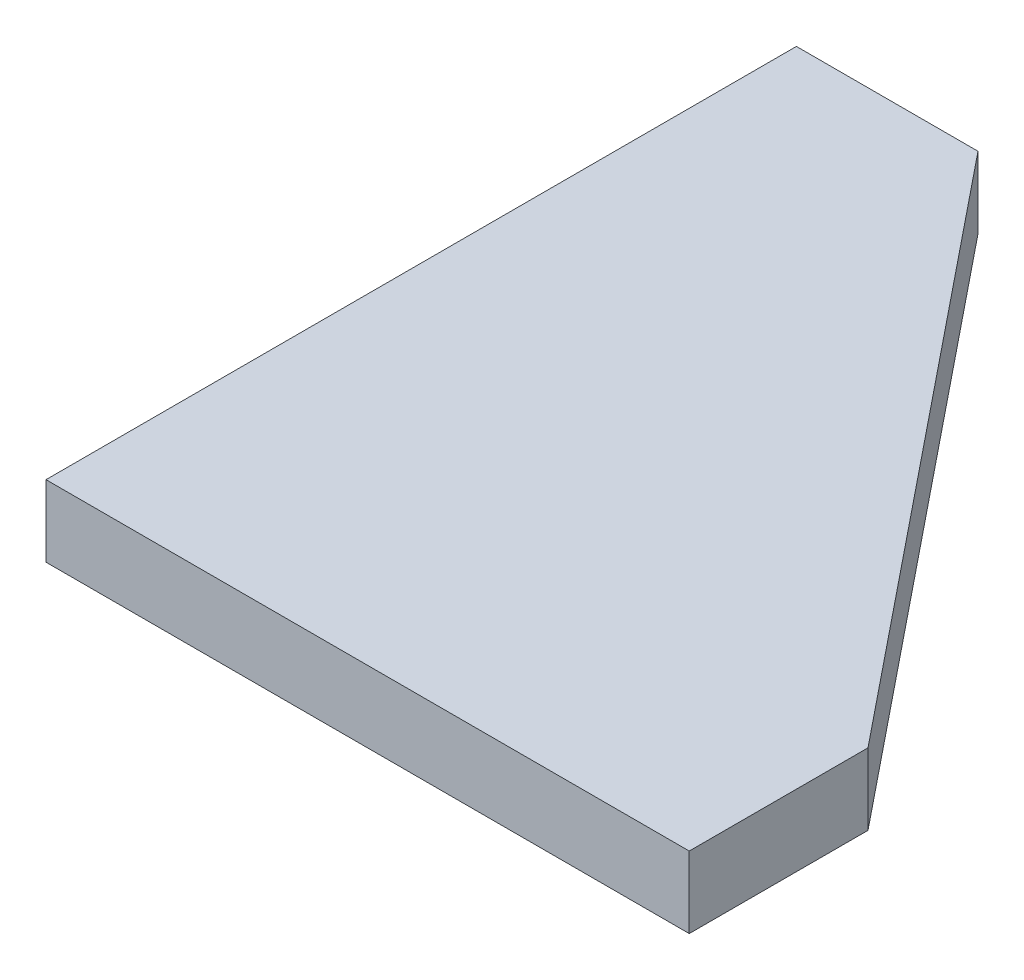
ISO-10303-21;
HEADER;
FILE_DESCRIPTION(('STEP AP214'),'2;1');
FILE_NAME('part.step','',(''),(''),'','','');
FILE_SCHEMA(('AUTOMOTIVE_DESIGN { 1 0 10303 214 1 1 1 1 }'));
ENDSEC;
DATA;
#1=APPLICATION_CONTEXT('core data for automotive mechanical design processes');
#2=APPLICATION_PROTOCOL_DEFINITION('international standard','automotive_design',2000,#1);
#3=PRODUCT_CONTEXT('',#1,'mechanical');
#4=PRODUCT('Part','Part','',(#3));
#5=PRODUCT_RELATED_PRODUCT_CATEGORY('part','',(#4));
#6=PRODUCT_DEFINITION_FORMATION('','',#4);
#7=PRODUCT_DEFINITION_CONTEXT('part definition',#1,'design');
#8=PRODUCT_DEFINITION('design','',#6,#7);
#9=PRODUCT_DEFINITION_SHAPE('','',#8);
#10=(LENGTH_UNIT() NAMED_UNIT(*) SI_UNIT(.MILLI.,.METRE.));
#11=(NAMED_UNIT(*) PLANE_ANGLE_UNIT() SI_UNIT($,.RADIAN.));
#12=(NAMED_UNIT(*) SI_UNIT($,.STERADIAN.) SOLID_ANGLE_UNIT());
#13=UNCERTAINTY_MEASURE_WITH_UNIT(LENGTH_MEASURE(1.E-05),#10,'distance_accuracy_value','');
#14=(GEOMETRIC_REPRESENTATION_CONTEXT(3) GLOBAL_UNCERTAINTY_ASSIGNED_CONTEXT((#13)) GLOBAL_UNIT_ASSIGNED_CONTEXT((#10,
#11,#12)) REPRESENTATION_CONTEXT('',''));
#15=CARTESIAN_POINT('',(0.,0.,0.));
#16=DIRECTION('',(0.,0.,1.));
#17=DIRECTION('',(1.,0.,0.));
#18=AXIS2_PLACEMENT_3D('',#15,#16,#17);
#19=CARTESIAN_POINT('',(0.,4.,0.));
#20=DIRECTION('',(1.,0.,0.));
#21=DIRECTION('',(0.,0.,-1.));
#22=AXIS2_PLACEMENT_3D('',#19,#20,#21);
#23=PLANE('',#22);
#24=DIRECTION('',(0.,0.,1.));
#25=VECTOR('',#24,1.);
#26=CARTESIAN_POINT('',(0.,0.,0.));
#27=LINE('',#26,#25);
#28=CARTESIAN_POINT('',(0.,0.,-41.9799593719108));
#29=VERTEX_POINT('',#28);
#30=CARTESIAN_POINT('',(0.,0.,0.));
#31=VERTEX_POINT('',#30);
#32=EDGE_CURVE('E105',#29,#31,#27,.T.);
#33=ORIENTED_EDGE('',*,*,#32,.T.);
#34=DIRECTION('',(0.,-1.,0.));
#35=VECTOR('',#34,1.);
#36=CARTESIAN_POINT('',(0.,4.,0.));
#37=LINE('',#36,#35);
#38=CARTESIAN_POINT('',(0.,4.,0.));
#39=VERTEX_POINT('',#38);
#40=EDGE_CURVE('E11',#39,#31,#37,.T.);
#41=ORIENTED_EDGE('',*,*,#40,.F.);
#42=DIRECTION('',(0.,0.,1.));
#43=VECTOR('',#42,1.);
#44=CARTESIAN_POINT('',(0.,4.,0.));
#45=LINE('',#44,#43);
#46=CARTESIAN_POINT('',(0.,4.,-41.9799593719108));
#47=VERTEX_POINT('',#46);
#48=EDGE_CURVE('E113',#47,#39,#45,.T.);
#49=ORIENTED_EDGE('',*,*,#48,.F.);
#50=DIRECTION('',(0.,-1.,0.));
#51=VECTOR('',#50,1.);
#52=CARTESIAN_POINT('',(0.,4.,-41.9799593719108));
#53=LINE('',#52,#51);
#54=EDGE_CURVE('E101',#47,#29,#53,.T.);
#55=ORIENTED_EDGE('',*,*,#54,.T.);
#56=EDGE_LOOP('',(#33,#41,#49,#55));
#57=FACE_BOUND('',#56,.T.);
#58=ADVANCED_FACE('F31',(#57),#23,.F.);
#59=CARTESIAN_POINT('',(0.,4.,0.));
#60=DIRECTION('',(0.,0.,-1.));
#61=DIRECTION('',(-1.,0.,0.));
#62=AXIS2_PLACEMENT_3D('',#59,#60,#61);
#63=PLANE('',#62);
#64=DIRECTION('',(1.,0.,0.));
#65=VECTOR('',#64,1.);
#66=CARTESIAN_POINT('',(0.,0.,0.));
#67=LINE('',#66,#65);
#68=CARTESIAN_POINT('',(35.9838685392107,0.,0.));
#69=VERTEX_POINT('',#68);
#70=EDGE_CURVE('E108',#31,#69,#67,.T.);
#71=ORIENTED_EDGE('',*,*,#70,.T.);
#72=DIRECTION('',(0.,-1.,0.));
#73=VECTOR('',#72,1.);
#74=CARTESIAN_POINT('',(35.9838685392107,4.,0.));
#75=LINE('',#74,#73);
#76=CARTESIAN_POINT('',(35.9838685392107,4.,0.));
#77=VERTEX_POINT('',#76);
#78=EDGE_CURVE('E39',#77,#69,#75,.T.);
#79=ORIENTED_EDGE('',*,*,#78,.F.);
#80=DIRECTION('',(1.,0.,0.));
#81=VECTOR('',#80,1.);
#82=CARTESIAN_POINT('',(0.,4.,0.));
#83=LINE('',#82,#81);
#84=EDGE_CURVE('E81',#39,#77,#83,.T.);
#85=ORIENTED_EDGE('',*,*,#84,.F.);
#86=ORIENTED_EDGE('',*,*,#40,.T.);
#87=EDGE_LOOP('',(#71,#79,#85,#86));
#88=FACE_BOUND('',#87,.T.);
#89=ADVANCED_FACE('F132',(#88),#63,.F.);
#90=CARTESIAN_POINT('',(35.9838685392107,4.,-10.0000001189553));
#91=DIRECTION('',(-1.,0.,0.));
#92=DIRECTION('',(0.,0.,1.));
#93=AXIS2_PLACEMENT_3D('',#90,#91,#92);
#94=PLANE('',#93);
#95=DIRECTION('',(0.,0.,-1.));
#96=VECTOR('',#95,1.);
#97=CARTESIAN_POINT('',(35.9838685392107,0.,-10.0000001189553));
#98=LINE('',#97,#96);
#99=CARTESIAN_POINT('',(35.9838685392107,0.,-10.0000001189553));
#100=VERTEX_POINT('',#99);
#101=EDGE_CURVE('E96',#69,#100,#98,.T.);
#102=ORIENTED_EDGE('',*,*,#101,.T.);
#103=DIRECTION('',(0.,-1.,0.));
#104=VECTOR('',#103,1.);
#105=CARTESIAN_POINT('',(35.9838685392107,4.,-10.0000001189553));
#106=LINE('',#105,#104);
#107=CARTESIAN_POINT('',(35.9838685392107,4.,-10.0000001189553));
#108=VERTEX_POINT('',#107);
#109=EDGE_CURVE('E93',#108,#100,#106,.T.);
#110=ORIENTED_EDGE('',*,*,#109,.F.);
#111=DIRECTION('',(0.,0.,-1.));
#112=VECTOR('',#111,1.);
#113=CARTESIAN_POINT('',(35.9838685392107,4.,-10.0000001189553));
#114=LINE('',#113,#112);
#115=EDGE_CURVE('E85',#77,#108,#114,.T.);
#116=ORIENTED_EDGE('',*,*,#115,.F.);
#117=ORIENTED_EDGE('',*,*,#78,.T.);
#118=EDGE_LOOP('',(#102,#110,#116,#117));
#119=FACE_BOUND('',#118,.T.);
#120=ADVANCED_FACE('F94',(#119),#94,.F.);
#121=CARTESIAN_POINT('',(10.1583775056886,4.,-41.9799593719108));
#122=DIRECTION('',(-0.777994404596502,0.,0.628271204510071));
#123=DIRECTION('',(0.628271204510071,0.,0.777994404596502));
#124=AXIS2_PLACEMENT_3D('',#121,#122,#123);
#125=PLANE('',#124);
#126=DIRECTION('',(-0.628271204510071,0.,-0.777994404596501));
#127=VECTOR('',#126,1.);
#128=CARTESIAN_POINT('',(10.1583775056886,0.,-41.9799593719108));
#129=LINE('',#128,#127);
#130=CARTESIAN_POINT('',(10.1583775056886,0.,-41.9799593719108));
#131=VERTEX_POINT('',#130);
#132=EDGE_CURVE('E67',#100,#131,#129,.T.);
#133=ORIENTED_EDGE('',*,*,#132,.T.);
#134=DIRECTION('',(0.,-1.,0.));
#135=VECTOR('',#134,1.);
#136=CARTESIAN_POINT('',(10.1583775056886,4.,-41.9799593719108));
#137=LINE('',#136,#135);
#138=CARTESIAN_POINT('',(10.1583775056886,4.,-41.9799593719108));
#139=VERTEX_POINT('',#138);
#140=EDGE_CURVE('E97',#139,#131,#137,.T.);
#141=ORIENTED_EDGE('',*,*,#140,.F.);
#142=DIRECTION('',(-0.628271204510071,0.,-0.777994404596501));
#143=VECTOR('',#142,1.);
#144=CARTESIAN_POINT('',(10.1583775056886,4.,-41.9799593719108));
#145=LINE('',#144,#143);
#146=EDGE_CURVE('E89',#108,#139,#145,.T.);
#147=ORIENTED_EDGE('',*,*,#146,.F.);
#148=ORIENTED_EDGE('',*,*,#109,.T.);
#149=EDGE_LOOP('',(#133,#141,#147,#148));
#150=FACE_BOUND('',#149,.T.);
#151=ADVANCED_FACE('F99',(#150),#125,.F.);
#152=CARTESIAN_POINT('',(0.,4.,-41.9799593719108));
#153=DIRECTION('',(0.,0.,1.));
#154=DIRECTION('',(1.,0.,0.));
#155=AXIS2_PLACEMENT_3D('',#152,#153,#154);
#156=PLANE('',#155);
#157=DIRECTION('',(-1.,0.,0.));
#158=VECTOR('',#157,1.);
#159=CARTESIAN_POINT('',(0.,0.,-41.9799593719108));
#160=LINE('',#159,#158);
#161=EDGE_CURVE('E73',#131,#29,#160,.T.);
#162=ORIENTED_EDGE('',*,*,#161,.T.);
#163=ORIENTED_EDGE('',*,*,#54,.F.);
#164=DIRECTION('',(-1.,0.,0.));
#165=VECTOR('',#164,1.);
#166=CARTESIAN_POINT('',(0.,4.,-41.9799593719108));
#167=LINE('',#166,#165);
#168=EDGE_CURVE('E47',#139,#47,#167,.T.);
#169=ORIENTED_EDGE('',*,*,#168,.F.);
#170=ORIENTED_EDGE('',*,*,#140,.T.);
#171=EDGE_LOOP('',(#162,#163,#169,#170));
#172=FACE_BOUND('',#171,.T.);
#173=ADVANCED_FACE('F121',(#172),#156,.F.);
#174=CARTESIAN_POINT('',(0.,4.,-41.9799593719108));
#175=DIRECTION('',(0.,-1.,0.));
#176=DIRECTION('',(0.,0.,-1.));
#177=AXIS2_PLACEMENT_3D('',#174,#175,#176);
#178=PLANE('',#177);
#179=ORIENTED_EDGE('',*,*,#48,.T.);
#180=ORIENTED_EDGE('',*,*,#84,.T.);
#181=ORIENTED_EDGE('',*,*,#115,.T.);
#182=ORIENTED_EDGE('',*,*,#146,.T.);
#183=ORIENTED_EDGE('',*,*,#168,.T.);
#184=EDGE_LOOP('',(#179,#180,#181,#182,#183));
#185=FACE_BOUND('',#184,.T.);
#186=ADVANCED_FACE('F87',(#185),#178,.F.);
#187=CARTESIAN_POINT('',(0.,0.,-41.9799593719108));
#188=DIRECTION('',(0.,-1.,0.));
#189=DIRECTION('',(0.,0.,-1.));
#190=AXIS2_PLACEMENT_3D('',#187,#188,#189);
#191=PLANE('',#190);
#192=ORIENTED_EDGE('',*,*,#32,.F.);
#193=ORIENTED_EDGE('',*,*,#161,.F.);
#194=ORIENTED_EDGE('',*,*,#132,.F.);
#195=ORIENTED_EDGE('',*,*,#101,.F.);
#196=ORIENTED_EDGE('',*,*,#70,.F.);
#197=EDGE_LOOP('',(#192,#193,#194,#195,#196));
#198=FACE_BOUND('',#197,.T.);
#199=ADVANCED_FACE('F117',(#198),#191,.T.);
#200=CLOSED_SHELL('',(#58,#89,#120,#151,#173,#186,#199));
#201=MANIFOLD_SOLID_BREP('B2',#200);
#202=ADVANCED_BREP_SHAPE_REPRESENTATION('',(#18,#201),#14);
#203=SHAPE_DEFINITION_REPRESENTATION(#9,#202);
ENDSEC;
END-ISO-10303-21;
